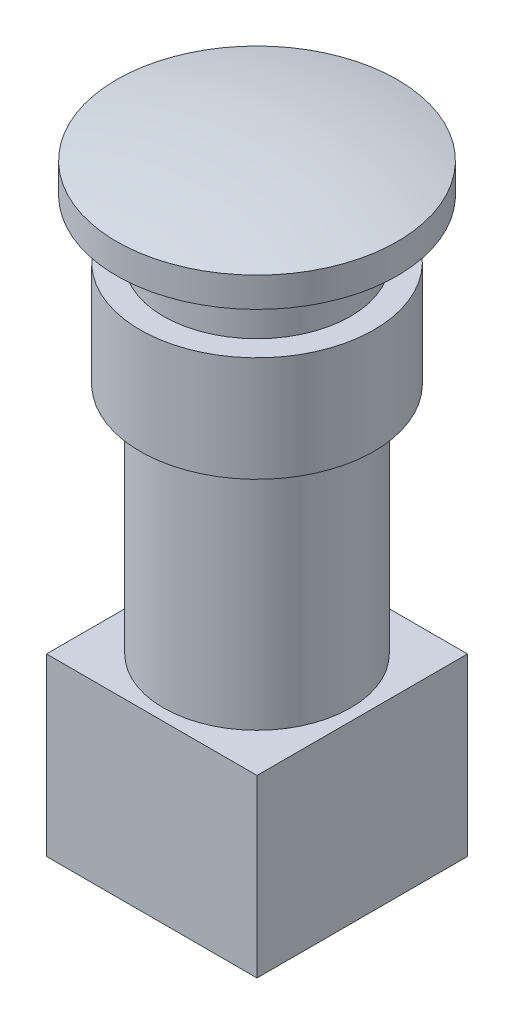
ISO-10303-21;
HEADER;
FILE_DESCRIPTION(('STEP AP214'),'2;1');
FILE_NAME('part.step','',(''),(''),'','','');
FILE_SCHEMA(('AUTOMOTIVE_DESIGN { 1 0 10303 214 1 1 1 1 }'));
ENDSEC;
DATA;
#1=APPLICATION_CONTEXT('core data for automotive mechanical design processes');
#2=APPLICATION_PROTOCOL_DEFINITION('international standard','automotive_design',2000,#1);
#3=PRODUCT_CONTEXT('',#1,'mechanical');
#4=PRODUCT('Part','Part','',(#3));
#5=PRODUCT_RELATED_PRODUCT_CATEGORY('part','',(#4));
#6=PRODUCT_DEFINITION_FORMATION('','',#4);
#7=PRODUCT_DEFINITION_CONTEXT('part definition',#1,'design');
#8=PRODUCT_DEFINITION('design','',#6,#7);
#9=PRODUCT_DEFINITION_SHAPE('','',#8);
#10=(LENGTH_UNIT() NAMED_UNIT(*) SI_UNIT(.MILLI.,.METRE.));
#11=(NAMED_UNIT(*) PLANE_ANGLE_UNIT() SI_UNIT($,.RADIAN.));
#12=(NAMED_UNIT(*) SI_UNIT($,.STERADIAN.) SOLID_ANGLE_UNIT());
#13=UNCERTAINTY_MEASURE_WITH_UNIT(LENGTH_MEASURE(1.E-05),#10,'distance_accuracy_value','');
#14=(GEOMETRIC_REPRESENTATION_CONTEXT(3) GLOBAL_UNCERTAINTY_ASSIGNED_CONTEXT((#13)) GLOBAL_UNIT_ASSIGNED_CONTEXT((#10,
#11,#12)) REPRESENTATION_CONTEXT('',''));
#15=CARTESIAN_POINT('',(0.,0.,0.));
#16=DIRECTION('',(0.,0.,1.));
#17=DIRECTION('',(1.,0.,0.));
#18=AXIS2_PLACEMENT_3D('',#15,#16,#17);
#19=CARTESIAN_POINT('',(0.,0.,0.));
#20=DIRECTION('',(0.,-1.,0.));
#21=DIRECTION('',(0.,0.,-1.));
#22=AXIS2_PLACEMENT_3D('',#19,#20,#21);
#23=CYLINDRICAL_SURFACE('',#22,8.);
#24=CARTESIAN_POINT('',(0.,0.,0.));
#25=DIRECTION('',(0.,-1.,0.));
#26=DIRECTION('',(0.,0.,-1.));
#27=AXIS2_PLACEMENT_3D('',#24,#25,#26);
#28=CIRCLE('',#27,8.);
#29=CARTESIAN_POINT('',(0.,0.,-8.));
#30=VERTEX_POINT('',#29);
#31=EDGE_CURVE('E11',#30,#30,#28,.T.);
#32=ORIENTED_EDGE('',*,*,#31,.F.);
#33=EDGE_LOOP('',(#32));
#34=FACE_BOUND('',#33,.T.);
#35=CARTESIAN_POINT('',(0.,20.,0.));
#36=DIRECTION('',(0.,-1.,0.));
#37=DIRECTION('',(0.,0.,-1.));
#38=AXIS2_PLACEMENT_3D('',#35,#36,#37);
#39=CIRCLE('',#38,8.);
#40=CARTESIAN_POINT('',(0.,20.,-8.));
#41=VERTEX_POINT('',#40);
#42=EDGE_CURVE('E40',#41,#41,#39,.T.);
#43=ORIENTED_EDGE('',*,*,#42,.T.);
#44=EDGE_LOOP('',(#43));
#45=FACE_BOUND('',#44,.T.);
#46=ADVANCED_FACE('F32',(#34,#45),#23,.T.);
#47=CARTESIAN_POINT('',(-10.,20.,0.));
#48=DIRECTION('',(0.,1.,0.));
#49=DIRECTION('',(0.,0.,1.));
#50=AXIS2_PLACEMENT_3D('',#47,#48,#49);
#51=PLANE('',#50);
#52=ORIENTED_EDGE('',*,*,#42,.F.);
#53=EDGE_LOOP('',(#52));
#54=FACE_BOUND('',#53,.T.);
#55=CARTESIAN_POINT('',(0.,20.,0.));
#56=DIRECTION('',(0.,-1.,0.));
#57=DIRECTION('',(0.,0.,-1.));
#58=AXIS2_PLACEMENT_3D('',#55,#56,#57);
#59=CIRCLE('',#58,10.);
#60=CARTESIAN_POINT('',(0.,20.,-10.));
#61=VERTEX_POINT('',#60);
#62=EDGE_CURVE('E123',#61,#61,#59,.T.);
#63=ORIENTED_EDGE('',*,*,#62,.T.);
#64=EDGE_LOOP('',(#63));
#65=FACE_BOUND('',#64,.T.);
#66=ADVANCED_FACE('F129',(#54,#65),#51,.F.);
#67=CARTESIAN_POINT('',(0.,0.,0.));
#68=DIRECTION('',(0.,-1.,0.));
#69=DIRECTION('',(0.,0.,-1.));
#70=AXIS2_PLACEMENT_3D('',#67,#68,#69);
#71=CYLINDRICAL_SURFACE('',#70,10.);
#72=ORIENTED_EDGE('',*,*,#62,.F.);
#73=EDGE_LOOP('',(#72));
#74=FACE_BOUND('',#73,.T.);
#75=CARTESIAN_POINT('',(0.,29.,0.));
#76=DIRECTION('',(0.,-1.,0.));
#77=DIRECTION('',(0.,0.,-1.));
#78=AXIS2_PLACEMENT_3D('',#75,#76,#77);
#79=CIRCLE('',#78,10.);
#80=CARTESIAN_POINT('',(0.,29.,-10.));
#81=VERTEX_POINT('',#80);
#82=EDGE_CURVE('E120',#81,#81,#79,.T.);
#83=ORIENTED_EDGE('',*,*,#82,.T.);
#84=EDGE_LOOP('',(#83));
#85=FACE_BOUND('',#84,.T.);
#86=ADVANCED_FACE('F132',(#74,#85),#71,.T.);
#87=CARTESIAN_POINT('',(-8.,29.,0.));
#88=DIRECTION('',(0.,-1.,0.));
#89=DIRECTION('',(0.,0.,-1.));
#90=AXIS2_PLACEMENT_3D('',#87,#88,#89);
#91=PLANE('',#90);
#92=ORIENTED_EDGE('',*,*,#82,.F.);
#93=EDGE_LOOP('',(#92));
#94=FACE_BOUND('',#93,.T.);
#95=CARTESIAN_POINT('',(0.,29.,0.));
#96=DIRECTION('',(0.,-1.,0.));
#97=DIRECTION('',(0.,0.,-1.));
#98=AXIS2_PLACEMENT_3D('',#95,#96,#97);
#99=CIRCLE('',#98,8.);
#100=CARTESIAN_POINT('',(0.,29.,-8.));
#101=VERTEX_POINT('',#100);
#102=EDGE_CURVE('E117',#101,#101,#99,.T.);
#103=ORIENTED_EDGE('',*,*,#102,.T.);
#104=EDGE_LOOP('',(#103));
#105=FACE_BOUND('',#104,.T.);
#106=ADVANCED_FACE('F137',(#94,#105),#91,.F.);
#107=CARTESIAN_POINT('',(0.,0.,0.));
#108=DIRECTION('',(0.,-1.,0.));
#109=DIRECTION('',(0.,0.,-1.));
#110=AXIS2_PLACEMENT_3D('',#107,#108,#109);
#111=CYLINDRICAL_SURFACE('',#110,8.);
#112=ORIENTED_EDGE('',*,*,#102,.F.);
#113=EDGE_LOOP('',(#112));
#114=FACE_BOUND('',#113,.T.);
#115=CARTESIAN_POINT('',(0.,34.,0.));
#116=DIRECTION('',(0.,-1.,0.));
#117=DIRECTION('',(0.,0.,-1.));
#118=AXIS2_PLACEMENT_3D('',#115,#116,#117);
#119=CIRCLE('',#118,8.);
#120=CARTESIAN_POINT('',(0.,34.,-8.));
#121=VERTEX_POINT('',#120);
#122=EDGE_CURVE('E114',#121,#121,#119,.T.);
#123=ORIENTED_EDGE('',*,*,#122,.T.);
#124=EDGE_LOOP('',(#123));
#125=FACE_BOUND('',#124,.T.);
#126=ADVANCED_FACE('F143',(#114,#125),#111,.T.);
#127=CARTESIAN_POINT('',(-12.,34.,0.));
#128=DIRECTION('',(0.,1.,0.));
#129=DIRECTION('',(0.,0.,1.));
#130=AXIS2_PLACEMENT_3D('',#127,#128,#129);
#131=PLANE('',#130);
#132=ORIENTED_EDGE('',*,*,#122,.F.);
#133=EDGE_LOOP('',(#132));
#134=FACE_BOUND('',#133,.T.);
#135=CARTESIAN_POINT('',(0.,34.,0.));
#136=DIRECTION('',(0.,-1.,0.));
#137=DIRECTION('',(0.,0.,-1.));
#138=AXIS2_PLACEMENT_3D('',#135,#136,#137);
#139=CIRCLE('',#138,12.);
#140=CARTESIAN_POINT('',(0.,34.,-12.));
#141=VERTEX_POINT('',#140);
#142=EDGE_CURVE('E111',#141,#141,#139,.T.);
#143=ORIENTED_EDGE('',*,*,#142,.T.);
#144=EDGE_LOOP('',(#143));
#145=FACE_BOUND('',#144,.T.);
#146=ADVANCED_FACE('F149',(#134,#145),#131,.F.);
#147=CARTESIAN_POINT('',(0.,0.,0.));
#148=DIRECTION('',(0.,-1.,0.));
#149=DIRECTION('',(0.,0.,-1.));
#150=AXIS2_PLACEMENT_3D('',#147,#148,#149);
#151=CYLINDRICAL_SURFACE('',#150,12.);
#152=ORIENTED_EDGE('',*,*,#142,.F.);
#153=EDGE_LOOP('',(#152));
#154=FACE_BOUND('',#153,.T.);
#155=CARTESIAN_POINT('',(0.,36.5386443980464,0.));
#156=DIRECTION('',(0.,-1.,0.));
#157=DIRECTION('',(0.,0.,-1.));
#158=AXIS2_PLACEMENT_3D('',#155,#156,#157);
#159=CIRCLE('',#158,12.);
#160=CARTESIAN_POINT('',(0.,36.5386443980464,-12.));
#161=VERTEX_POINT('',#160);
#162=EDGE_CURVE('E108',#161,#161,#159,.T.);
#163=ORIENTED_EDGE('',*,*,#162,.T.);
#164=EDGE_LOOP('',(#163));
#165=FACE_BOUND('',#164,.T.);
#166=ADVANCED_FACE('F155',(#154,#165),#151,.T.);
#167=CARTESIAN_POINT('',(0.,-12.,0.));
#168=DIRECTION('',(0.,-1.,0.));
#169=DIRECTION('',(-1.,0.,0.));
#170=AXIS2_PLACEMENT_3D('',#167,#168,#169);
#171=SPHERICAL_SURFACE('',#170,50.);
#172=ORIENTED_EDGE('',*,*,#162,.F.);
#173=EDGE_LOOP('',(#172));
#174=FACE_BOUND('',#173,.T.);
#175=ADVANCED_FACE('F161',(#174),#171,.T.);
#176=CARTESIAN_POINT('',(-9.,0.,-9.));
#177=DIRECTION('',(0.,-1.,0.));
#178=DIRECTION('',(0.,0.,-1.));
#179=AXIS2_PLACEMENT_3D('',#176,#177,#178);
#180=PLANE('',#179);
#181=DIRECTION('',(0.,0.,-1.));
#182=VECTOR('',#181,1.);
#183=CARTESIAN_POINT('',(-9.,0.,9.));
#184=LINE('',#183,#182);
#185=CARTESIAN_POINT('',(-9.,0.,9.));
#186=VERTEX_POINT('',#185);
#187=CARTESIAN_POINT('',(-9.,0.,-9.));
#188=VERTEX_POINT('',#187);
#189=EDGE_CURVE('E99',#186,#188,#184,.T.);
#190=ORIENTED_EDGE('',*,*,#189,.F.);
#191=DIRECTION('',(-1.,0.,0.));
#192=VECTOR('',#191,1.);
#193=CARTESIAN_POINT('',(-9.,0.,9.));
#194=LINE('',#193,#192);
#195=CARTESIAN_POINT('',(9.,0.,9.));
#196=VERTEX_POINT('',#195);
#197=EDGE_CURVE('E71',#196,#186,#194,.T.);
#198=ORIENTED_EDGE('',*,*,#197,.F.);
#199=DIRECTION('',(0.,0.,1.));
#200=VECTOR('',#199,1.);
#201=CARTESIAN_POINT('',(9.,0.,9.));
#202=LINE('',#201,#200);
#203=CARTESIAN_POINT('',(9.,0.,-9.));
#204=VERTEX_POINT('',#203);
#205=EDGE_CURVE('E65',#204,#196,#202,.T.);
#206=ORIENTED_EDGE('',*,*,#205,.F.);
#207=DIRECTION('',(1.,0.,0.));
#208=VECTOR('',#207,1.);
#209=CARTESIAN_POINT('',(-9.,0.,-9.));
#210=LINE('',#209,#208);
#211=EDGE_CURVE('E89',#188,#204,#210,.T.);
#212=ORIENTED_EDGE('',*,*,#211,.F.);
#213=EDGE_LOOP('',(#190,#198,#206,#212));
#214=FACE_BOUND('',#213,.T.);
#215=ORIENTED_EDGE('',*,*,#31,.T.);
#216=EDGE_LOOP('',(#215));
#217=FACE_BOUND('',#216,.T.);
#218=ADVANCED_FACE('F166',(#214,#217),#180,.F.);
#219=CARTESIAN_POINT('',(-9.,-15.,9.));
#220=DIRECTION('',(1.,0.,0.));
#221=DIRECTION('',(0.,0.,-1.));
#222=AXIS2_PLACEMENT_3D('',#219,#220,#221);
#223=PLANE('',#222);
#224=ORIENTED_EDGE('',*,*,#189,.T.);
#225=DIRECTION('',(0.,1.,0.));
#226=VECTOR('',#225,1.);
#227=CARTESIAN_POINT('',(-9.,-15.,-9.));
#228=LINE('',#227,#226);
#229=CARTESIAN_POINT('',(-9.,-15.,-9.));
#230=VERTEX_POINT('',#229);
#231=EDGE_CURVE('E90',#230,#188,#228,.T.);
#232=ORIENTED_EDGE('',*,*,#231,.F.);
#233=DIRECTION('',(0.,0.,-1.));
#234=VECTOR('',#233,1.);
#235=CARTESIAN_POINT('',(-9.,-15.,9.));
#236=LINE('',#235,#234);
#237=CARTESIAN_POINT('',(-9.,-15.,9.));
#238=VERTEX_POINT('',#237);
#239=EDGE_CURVE('E84',#238,#230,#236,.T.);
#240=ORIENTED_EDGE('',*,*,#239,.F.);
#241=DIRECTION('',(0.,1.,0.));
#242=VECTOR('',#241,1.);
#243=CARTESIAN_POINT('',(-9.,-15.,9.));
#244=LINE('',#243,#242);
#245=EDGE_CURVE('E95',#238,#186,#244,.T.);
#246=ORIENTED_EDGE('',*,*,#245,.T.);
#247=EDGE_LOOP('',(#224,#232,#240,#246));
#248=FACE_BOUND('',#247,.T.);
#249=ADVANCED_FACE('F171',(#248),#223,.F.);
#250=CARTESIAN_POINT('',(-9.,-15.,-9.));
#251=DIRECTION('',(0.,0.,1.));
#252=DIRECTION('',(1.,0.,0.));
#253=AXIS2_PLACEMENT_3D('',#250,#251,#252);
#254=PLANE('',#253);
#255=ORIENTED_EDGE('',*,*,#211,.T.);
#256=DIRECTION('',(0.,1.,0.));
#257=VECTOR('',#256,1.);
#258=CARTESIAN_POINT('',(9.,-15.,-9.));
#259=LINE('',#258,#257);
#260=CARTESIAN_POINT('',(9.,-15.,-9.));
#261=VERTEX_POINT('',#260);
#262=EDGE_CURVE('E87',#261,#204,#259,.T.);
#263=ORIENTED_EDGE('',*,*,#262,.F.);
#264=DIRECTION('',(1.,0.,0.));
#265=VECTOR('',#264,1.);
#266=CARTESIAN_POINT('',(-9.,-15.,-9.));
#267=LINE('',#266,#265);
#268=EDGE_CURVE('E79',#230,#261,#267,.T.);
#269=ORIENTED_EDGE('',*,*,#268,.F.);
#270=ORIENTED_EDGE('',*,*,#231,.T.);
#271=EDGE_LOOP('',(#255,#263,#269,#270));
#272=FACE_BOUND('',#271,.T.);
#273=ADVANCED_FACE('F88',(#272),#254,.F.);
#274=CARTESIAN_POINT('',(9.,-15.,9.));
#275=DIRECTION('',(-1.,0.,0.));
#276=DIRECTION('',(0.,0.,1.));
#277=AXIS2_PLACEMENT_3D('',#274,#275,#276);
#278=PLANE('',#277);
#279=ORIENTED_EDGE('',*,*,#205,.T.);
#280=DIRECTION('',(0.,1.,0.));
#281=VECTOR('',#280,1.);
#282=CARTESIAN_POINT('',(9.,-15.,9.));
#283=LINE('',#282,#281);
#284=CARTESIAN_POINT('',(9.,-15.,9.));
#285=VERTEX_POINT('',#284);
#286=EDGE_CURVE('E91',#285,#196,#283,.T.);
#287=ORIENTED_EDGE('',*,*,#286,.F.);
#288=DIRECTION('',(0.,0.,1.));
#289=VECTOR('',#288,1.);
#290=CARTESIAN_POINT('',(9.,-15.,9.));
#291=LINE('',#290,#289);
#292=EDGE_CURVE('E82',#261,#285,#291,.T.);
#293=ORIENTED_EDGE('',*,*,#292,.F.);
#294=ORIENTED_EDGE('',*,*,#262,.T.);
#295=EDGE_LOOP('',(#279,#287,#293,#294));
#296=FACE_BOUND('',#295,.T.);
#297=ADVANCED_FACE('F93',(#296),#278,.F.);
#298=CARTESIAN_POINT('',(-9.,-15.,9.));
#299=DIRECTION('',(0.,0.,-1.));
#300=DIRECTION('',(-1.,0.,0.));
#301=AXIS2_PLACEMENT_3D('',#298,#299,#300);
#302=PLANE('',#301);
#303=ORIENTED_EDGE('',*,*,#197,.T.);
#304=ORIENTED_EDGE('',*,*,#245,.F.);
#305=DIRECTION('',(-1.,0.,0.));
#306=VECTOR('',#305,1.);
#307=CARTESIAN_POINT('',(-9.,-15.,9.));
#308=LINE('',#307,#306);
#309=EDGE_CURVE('E48',#285,#238,#308,.T.);
#310=ORIENTED_EDGE('',*,*,#309,.F.);
#311=ORIENTED_EDGE('',*,*,#286,.T.);
#312=EDGE_LOOP('',(#303,#304,#310,#311));
#313=FACE_BOUND('',#312,.T.);
#314=ADVANCED_FACE('F242',(#313),#302,.F.);
#315=CARTESIAN_POINT('',(-9.,-15.,-9.));
#316=DIRECTION('',(0.,-1.,0.));
#317=DIRECTION('',(0.,0.,-1.));
#318=AXIS2_PLACEMENT_3D('',#315,#316,#317);
#319=PLANE('',#318);
#320=ORIENTED_EDGE('',*,*,#239,.T.);
#321=ORIENTED_EDGE('',*,*,#268,.T.);
#322=ORIENTED_EDGE('',*,*,#292,.T.);
#323=ORIENTED_EDGE('',*,*,#309,.T.);
#324=EDGE_LOOP('',(#320,#321,#322,#323));
#325=FACE_BOUND('',#324,.T.);
#326=ADVANCED_FACE('F80',(#325),#319,.T.);
#327=CLOSED_SHELL('',(#46,#66,#86,#106,#126,#146,#166,#175,#218,#249,#273,#297,#314,#326));
#328=MANIFOLD_SOLID_BREP('B2',#327);
#329=ADVANCED_BREP_SHAPE_REPRESENTATION('',(#18,#328),#14);
#330=SHAPE_DEFINITION_REPRESENTATION(#9,#329);
ENDSEC;
END-ISO-10303-21;
